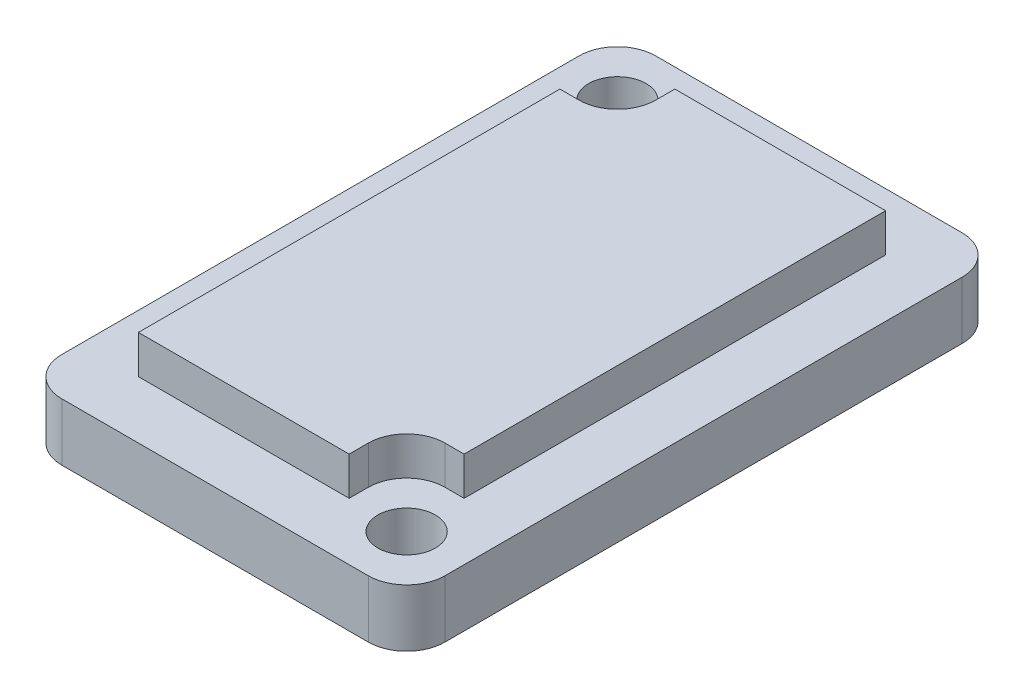
ISO-10303-21;
HEADER;
FILE_DESCRIPTION(('STEP AP214'),'2;1');
FILE_NAME('part.step','',(''),(''),'','','');
FILE_SCHEMA(('AUTOMOTIVE_DESIGN { 1 0 10303 214 1 1 1 1 }'));
ENDSEC;
DATA;
#1=APPLICATION_CONTEXT('core data for automotive mechanical design processes');
#2=APPLICATION_PROTOCOL_DEFINITION('international standard','automotive_design',2000,#1);
#3=PRODUCT_CONTEXT('',#1,'mechanical');
#4=PRODUCT('Part','Part','',(#3));
#5=PRODUCT_RELATED_PRODUCT_CATEGORY('part','',(#4));
#6=PRODUCT_DEFINITION_FORMATION('','',#4);
#7=PRODUCT_DEFINITION_CONTEXT('part definition',#1,'design');
#8=PRODUCT_DEFINITION('design','',#6,#7);
#9=PRODUCT_DEFINITION_SHAPE('','',#8);
#10=(LENGTH_UNIT() NAMED_UNIT(*) SI_UNIT(.MILLI.,.METRE.));
#11=(NAMED_UNIT(*) PLANE_ANGLE_UNIT() SI_UNIT($,.RADIAN.));
#12=(NAMED_UNIT(*) SI_UNIT($,.STERADIAN.) SOLID_ANGLE_UNIT());
#13=UNCERTAINTY_MEASURE_WITH_UNIT(LENGTH_MEASURE(1.E-05),#10,'distance_accuracy_value','');
#14=(GEOMETRIC_REPRESENTATION_CONTEXT(3) GLOBAL_UNCERTAINTY_ASSIGNED_CONTEXT((#13)) GLOBAL_UNIT_ASSIGNED_CONTEXT((#10,
#11,#12)) REPRESENTATION_CONTEXT('',''));
#15=CARTESIAN_POINT('',(0.,0.,0.));
#16=DIRECTION('',(0.,0.,1.));
#17=DIRECTION('',(1.,0.,0.));
#18=AXIS2_PLACEMENT_3D('',#15,#16,#17);
#19=CARTESIAN_POINT('',(0.,3.,0.));
#20=DIRECTION('',(0.,-1.,0.));
#21=DIRECTION('',(0.,0.,-1.));
#22=AXIS2_PLACEMENT_3D('',#19,#20,#21);
#23=PLANE('',#22);
#24=CARTESIAN_POINT('',(-7.,3.,-12.5));
#25=DIRECTION('',(0.,1.,0.));
#26=DIRECTION('',(0.,0.,1.));
#27=AXIS2_PLACEMENT_3D('',#24,#25,#26);
#28=CIRCLE('',#27,1.5);
#29=CARTESIAN_POINT('',(-7.,3.,-11.));
#30=VERTEX_POINT('',#29);
#31=EDGE_CURVE('E281',#30,#30,#28,.T.);
#32=ORIENTED_EDGE('',*,*,#31,.F.);
#33=EDGE_LOOP('',(#32));
#34=FACE_BOUND('',#33,.T.);
#35=CARTESIAN_POINT('',(7.,3.,12.5));
#36=DIRECTION('',(0.,1.,0.));
#37=DIRECTION('',(0.,0.,1.));
#38=AXIS2_PLACEMENT_3D('',#35,#36,#37);
#39=CIRCLE('',#38,1.5);
#40=CARTESIAN_POINT('',(7.,3.,14.));
#41=VERTEX_POINT('',#40);
#42=EDGE_CURVE('E288',#41,#41,#39,.T.);
#43=ORIENTED_EDGE('',*,*,#42,.F.);
#44=EDGE_LOOP('',(#43));
#45=FACE_BOUND('',#44,.T.);
#46=DIRECTION('',(-1.,0.,0.));
#47=VECTOR('',#46,1.);
#48=CARTESIAN_POINT('',(-10.,3.,-15.5));
#49=LINE('',#48,#47);
#50=CARTESIAN_POINT('',(8.,3.,-15.5));
#51=VERTEX_POINT('',#50);
#52=CARTESIAN_POINT('',(-8.,3.,-15.5));
#53=VERTEX_POINT('',#52);
#54=EDGE_CURVE('E208',#51,#53,#49,.T.);
#55=ORIENTED_EDGE('',*,*,#54,.T.);
#56=CARTESIAN_POINT('',(-8.,3.,-13.5));
#57=DIRECTION('',(0.,-1.,0.));
#58=DIRECTION('',(0.,0.,-1.));
#59=AXIS2_PLACEMENT_3D('',#56,#57,#58);
#60=CIRCLE('',#59,2.);
#61=CARTESIAN_POINT('',(-10.,3.,-13.5));
#62=VERTEX_POINT('',#61);
#63=EDGE_CURVE('E266',#53,#62,#60,.F.);
#64=ORIENTED_EDGE('',*,*,#63,.T.);
#65=DIRECTION('',(0.,0.,1.));
#66=VECTOR('',#65,1.);
#67=CARTESIAN_POINT('',(-10.,3.,15.5));
#68=LINE('',#67,#66);
#69=CARTESIAN_POINT('',(-10.,3.,13.5));
#70=VERTEX_POINT('',#69);
#71=EDGE_CURVE('E213',#62,#70,#68,.T.);
#72=ORIENTED_EDGE('',*,*,#71,.T.);
#73=CARTESIAN_POINT('',(-8.,3.,13.5));
#74=DIRECTION('',(0.,-1.,0.));
#75=DIRECTION('',(0.,0.,-1.));
#76=AXIS2_PLACEMENT_3D('',#73,#74,#75);
#77=CIRCLE('',#76,2.);
#78=CARTESIAN_POINT('',(-8.,3.,15.5));
#79=VERTEX_POINT('',#78);
#80=EDGE_CURVE('E263',#70,#79,#77,.F.);
#81=ORIENTED_EDGE('',*,*,#80,.T.);
#82=DIRECTION('',(1.,0.,0.));
#83=VECTOR('',#82,1.);
#84=CARTESIAN_POINT('',(-10.,3.,15.5));
#85=LINE('',#84,#83);
#86=CARTESIAN_POINT('',(8.,3.,15.5));
#87=VERTEX_POINT('',#86);
#88=EDGE_CURVE('E217',#79,#87,#85,.T.);
#89=ORIENTED_EDGE('',*,*,#88,.T.);
#90=CARTESIAN_POINT('',(8.,3.,13.5));
#91=DIRECTION('',(0.,-1.,0.));
#92=DIRECTION('',(0.,0.,-1.));
#93=AXIS2_PLACEMENT_3D('',#90,#91,#92);
#94=CIRCLE('',#93,2.);
#95=CARTESIAN_POINT('',(10.,3.,13.5));
#96=VERTEX_POINT('',#95);
#97=EDGE_CURVE('E257',#87,#96,#94,.F.);
#98=ORIENTED_EDGE('',*,*,#97,.T.);
#99=DIRECTION('',(0.,0.,-1.));
#100=VECTOR('',#99,1.);
#101=CARTESIAN_POINT('',(10.,3.,15.5));
#102=LINE('',#101,#100);
#103=CARTESIAN_POINT('',(10.,3.,-13.5));
#104=VERTEX_POINT('',#103);
#105=EDGE_CURVE('E204',#96,#104,#102,.T.);
#106=ORIENTED_EDGE('',*,*,#105,.T.);
#107=CARTESIAN_POINT('',(8.,3.,-13.5));
#108=DIRECTION('',(0.,-1.,0.));
#109=DIRECTION('',(0.,0.,-1.));
#110=AXIS2_PLACEMENT_3D('',#107,#108,#109);
#111=CIRCLE('',#110,2.);
#112=EDGE_CURVE('E260',#104,#51,#111,.F.);
#113=ORIENTED_EDGE('',*,*,#112,.T.);
#114=EDGE_LOOP('',(#55,#64,#72,#81,#89,#98,#106,#113));
#115=FACE_BOUND('',#114,.T.);
#116=DIRECTION('',(0.,0.,-1.));
#117=VECTOR('',#116,1.);
#118=CARTESIAN_POINT('',(7.,3.,9.50000000000001));
#119=LINE('',#118,#117);
#120=CARTESIAN_POINT('',(7.,3.,9.50000000000001));
#121=VERTEX_POINT('',#120);
#122=CARTESIAN_POINT('',(7.,3.,-12.5));
#123=VERTEX_POINT('',#122);
#124=EDGE_CURVE('E61',#121,#123,#119,.T.);
#125=ORIENTED_EDGE('',*,*,#124,.F.);
#126=DIRECTION('',(1.,0.,0.));
#127=VECTOR('',#126,1.);
#128=CARTESIAN_POINT('',(6.00000000000001,3.,9.50000000000001));
#129=LINE('',#128,#127);
#130=CARTESIAN_POINT('',(6.00000000000001,3.,9.50000000000001));
#131=VERTEX_POINT('',#130);
#132=EDGE_CURVE('E65',#131,#121,#129,.T.);
#133=ORIENTED_EDGE('',*,*,#132,.F.);
#134=CARTESIAN_POINT('',(6.,3.,11.5));
#135=DIRECTION('',(0.,-1.,0.));
#136=DIRECTION('',(0.,0.,1.));
#137=AXIS2_PLACEMENT_3D('',#134,#135,#136);
#138=CIRCLE('',#137,2.);
#139=CARTESIAN_POINT('',(4.,3.,11.5));
#140=VERTEX_POINT('',#139);
#141=EDGE_CURVE('E348',#140,#131,#138,.T.);
#142=ORIENTED_EDGE('',*,*,#141,.F.);
#143=DIRECTION('',(0.,0.,-1.));
#144=VECTOR('',#143,1.);
#145=CARTESIAN_POINT('',(4.,3.,12.5));
#146=LINE('',#145,#144);
#147=CARTESIAN_POINT('',(4.,3.,12.5));
#148=VERTEX_POINT('',#147);
#149=EDGE_CURVE('E344',#148,#140,#146,.T.);
#150=ORIENTED_EDGE('',*,*,#149,.F.);
#151=DIRECTION('',(1.,0.,0.));
#152=VECTOR('',#151,1.);
#153=CARTESIAN_POINT('',(-7.,3.,12.5));
#154=LINE('',#153,#152);
#155=CARTESIAN_POINT('',(-7.,3.,12.5));
#156=VERTEX_POINT('',#155);
#157=EDGE_CURVE('E340',#156,#148,#154,.T.);
#158=ORIENTED_EDGE('',*,*,#157,.F.);
#159=DIRECTION('',(0.,0.,1.));
#160=VECTOR('',#159,1.);
#161=CARTESIAN_POINT('',(-7.,3.,12.5));
#162=LINE('',#161,#160);
#163=CARTESIAN_POINT('',(-7.,3.,-9.50000000000001));
#164=VERTEX_POINT('',#163);
#165=EDGE_CURVE('E336',#164,#156,#162,.T.);
#166=ORIENTED_EDGE('',*,*,#165,.F.);
#167=DIRECTION('',(-1.,0.,0.));
#168=VECTOR('',#167,1.);
#169=CARTESIAN_POINT('',(-7.,3.,-9.50000000000001));
#170=LINE('',#169,#168);
#171=CARTESIAN_POINT('',(-6.00000000000001,3.,-9.50000000000001));
#172=VERTEX_POINT('',#171);
#173=EDGE_CURVE('E332',#172,#164,#170,.T.);
#174=ORIENTED_EDGE('',*,*,#173,.F.);
#175=CARTESIAN_POINT('',(-6.,3.,-11.5));
#176=DIRECTION('',(0.,-1.,0.));
#177=DIRECTION('',(0.,0.,1.));
#178=AXIS2_PLACEMENT_3D('',#175,#176,#177);
#179=CIRCLE('',#178,2.);
#180=CARTESIAN_POINT('',(-4.,3.,-11.5));
#181=VERTEX_POINT('',#180);
#182=EDGE_CURVE('E328',#181,#172,#179,.T.);
#183=ORIENTED_EDGE('',*,*,#182,.F.);
#184=DIRECTION('',(0.,0.,1.));
#185=VECTOR('',#184,1.);
#186=CARTESIAN_POINT('',(-4.,3.,-11.5));
#187=LINE('',#186,#185);
#188=CARTESIAN_POINT('',(-4.,3.,-12.5));
#189=VERTEX_POINT('',#188);
#190=EDGE_CURVE('E324',#189,#181,#187,.T.);
#191=ORIENTED_EDGE('',*,*,#190,.F.);
#192=DIRECTION('',(-1.,0.,0.));
#193=VECTOR('',#192,1.);
#194=CARTESIAN_POINT('',(-4.,3.,-12.5));
#195=LINE('',#194,#193);
#196=EDGE_CURVE('E321',#123,#189,#195,.T.);
#197=ORIENTED_EDGE('',*,*,#196,.F.);
#198=EDGE_LOOP('',(#125,#133,#142,#150,#158,#166,#174,#183,#191,#197));
#199=FACE_BOUND('',#198,.T.);
#200=ADVANCED_FACE('F43',(#34,#45,#115,#199),#23,.F.);
#201=CARTESIAN_POINT('',(10.,3.,15.5));
#202=DIRECTION('',(-1.,0.,0.));
#203=DIRECTION('',(0.,0.,1.));
#204=AXIS2_PLACEMENT_3D('',#201,#202,#203);
#205=PLANE('',#204);
#206=DIRECTION('',(0.,0.,-1.));
#207=VECTOR('',#206,1.);
#208=CARTESIAN_POINT('',(10.,0.,15.5));
#209=LINE('',#208,#207);
#210=CARTESIAN_POINT('',(10.,0.,13.5));
#211=VERTEX_POINT('',#210);
#212=CARTESIAN_POINT('',(10.,0.,-13.5));
#213=VERTEX_POINT('',#212);
#214=EDGE_CURVE('E193',#211,#213,#209,.T.);
#215=ORIENTED_EDGE('',*,*,#214,.T.);
#216=DIRECTION('',(0.,-1.,0.));
#217=VECTOR('',#216,1.);
#218=CARTESIAN_POINT('',(10.,3.,-13.5));
#219=LINE('',#218,#217);
#220=EDGE_CURVE('E11',#213,#104,#219,.F.);
#221=ORIENTED_EDGE('',*,*,#220,.T.);
#222=ORIENTED_EDGE('',*,*,#105,.F.);
#223=DIRECTION('',(0.,-1.,0.));
#224=VECTOR('',#223,1.);
#225=CARTESIAN_POINT('',(10.,3.,13.5));
#226=LINE('',#225,#224);
#227=EDGE_CURVE('E53',#96,#211,#226,.T.);
#228=ORIENTED_EDGE('',*,*,#227,.T.);
#229=EDGE_LOOP('',(#215,#221,#222,#228));
#230=FACE_BOUND('',#229,.T.);
#231=ADVANCED_FACE('F419',(#230),#205,.F.);
#232=CARTESIAN_POINT('',(-10.,3.,-15.5));
#233=DIRECTION('',(0.,0.,1.));
#234=DIRECTION('',(1.,0.,0.));
#235=AXIS2_PLACEMENT_3D('',#232,#233,#234);
#236=PLANE('',#235);
#237=DIRECTION('',(-1.,0.,0.));
#238=VECTOR('',#237,1.);
#239=CARTESIAN_POINT('',(-10.,0.,-15.5));
#240=LINE('',#239,#238);
#241=CARTESIAN_POINT('',(8.,0.,-15.5));
#242=VERTEX_POINT('',#241);
#243=CARTESIAN_POINT('',(-8.,0.,-15.5));
#244=VERTEX_POINT('',#243);
#245=EDGE_CURVE('E198',#242,#244,#240,.T.);
#246=ORIENTED_EDGE('',*,*,#245,.T.);
#247=DIRECTION('',(0.,-1.,0.));
#248=VECTOR('',#247,1.);
#249=CARTESIAN_POINT('',(-8.,3.,-15.5));
#250=LINE('',#249,#248);
#251=EDGE_CURVE('E254',#244,#53,#250,.F.);
#252=ORIENTED_EDGE('',*,*,#251,.T.);
#253=ORIENTED_EDGE('',*,*,#54,.F.);
#254=DIRECTION('',(0.,-1.,0.));
#255=VECTOR('',#254,1.);
#256=CARTESIAN_POINT('',(8.,3.,-15.5));
#257=LINE('',#256,#255);
#258=EDGE_CURVE('E250',#51,#242,#257,.T.);
#259=ORIENTED_EDGE('',*,*,#258,.T.);
#260=EDGE_LOOP('',(#246,#252,#253,#259));
#261=FACE_BOUND('',#260,.T.);
#262=ADVANCED_FACE('F425',(#261),#236,.F.);
#263=CARTESIAN_POINT('',(-10.,3.,15.5));
#264=DIRECTION('',(1.,0.,0.));
#265=DIRECTION('',(0.,0.,-1.));
#266=AXIS2_PLACEMENT_3D('',#263,#264,#265);
#267=PLANE('',#266);
#268=ORIENTED_EDGE('',*,*,#71,.F.);
#269=DIRECTION('',(0.,-1.,0.));
#270=VECTOR('',#269,1.);
#271=CARTESIAN_POINT('',(-10.,3.,-13.5));
#272=LINE('',#271,#270);
#273=CARTESIAN_POINT('',(-10.,0.,-13.5));
#274=VERTEX_POINT('',#273);
#275=EDGE_CURVE('E234',#62,#274,#272,.T.);
#276=ORIENTED_EDGE('',*,*,#275,.T.);
#277=DIRECTION('',(0.,0.,1.));
#278=VECTOR('',#277,1.);
#279=CARTESIAN_POINT('',(-10.,0.,15.5));
#280=LINE('',#279,#278);
#281=CARTESIAN_POINT('',(-10.,0.,13.5));
#282=VERTEX_POINT('',#281);
#283=EDGE_CURVE('E225',#274,#282,#280,.T.);
#284=ORIENTED_EDGE('',*,*,#283,.T.);
#285=DIRECTION('',(0.,-1.,0.));
#286=VECTOR('',#285,1.);
#287=CARTESIAN_POINT('',(-10.,3.,13.5));
#288=LINE('',#287,#286);
#289=EDGE_CURVE('E220',#282,#70,#288,.F.);
#290=ORIENTED_EDGE('',*,*,#289,.T.);
#291=EDGE_LOOP('',(#268,#276,#284,#290));
#292=FACE_BOUND('',#291,.T.);
#293=ADVANCED_FACE('F440',(#292),#267,.F.);
#294=CARTESIAN_POINT('',(-10.,3.,15.5));
#295=DIRECTION('',(0.,0.,-1.));
#296=DIRECTION('',(-1.,0.,0.));
#297=AXIS2_PLACEMENT_3D('',#294,#295,#296);
#298=PLANE('',#297);
#299=ORIENTED_EDGE('',*,*,#88,.F.);
#300=DIRECTION('',(0.,-1.,0.));
#301=VECTOR('',#300,1.);
#302=CARTESIAN_POINT('',(-8.,3.,15.5));
#303=LINE('',#302,#301);
#304=CARTESIAN_POINT('',(-8.,0.,15.5));
#305=VERTEX_POINT('',#304);
#306=EDGE_CURVE('E272',#79,#305,#303,.T.);
#307=ORIENTED_EDGE('',*,*,#306,.T.);
#308=DIRECTION('',(1.,0.,0.));
#309=VECTOR('',#308,1.);
#310=CARTESIAN_POINT('',(-10.,0.,15.5));
#311=LINE('',#310,#309);
#312=CARTESIAN_POINT('',(8.,0.,15.5));
#313=VERTEX_POINT('',#312);
#314=EDGE_CURVE('E209',#305,#313,#311,.T.);
#315=ORIENTED_EDGE('',*,*,#314,.T.);
#316=DIRECTION('',(0.,-1.,0.));
#317=VECTOR('',#316,1.);
#318=CARTESIAN_POINT('',(8.,3.,15.5));
#319=LINE('',#318,#317);
#320=EDGE_CURVE('E269',#313,#87,#319,.F.);
#321=ORIENTED_EDGE('',*,*,#320,.T.);
#322=EDGE_LOOP('',(#299,#307,#315,#321));
#323=FACE_BOUND('',#322,.T.);
#324=ADVANCED_FACE('F436',(#323),#298,.F.);
#325=CARTESIAN_POINT('',(0.,0.,0.));
#326=DIRECTION('',(0.,-1.,0.));
#327=DIRECTION('',(0.,0.,-1.));
#328=AXIS2_PLACEMENT_3D('',#325,#326,#327);
#329=PLANE('',#328);
#330=CARTESIAN_POINT('',(-7.,0.,-12.5));
#331=DIRECTION('',(0.,-1.,0.));
#332=DIRECTION('',(0.,0.,-1.));
#333=AXIS2_PLACEMENT_3D('',#330,#331,#332);
#334=CIRCLE('',#333,1.5);
#335=CARTESIAN_POINT('',(-7.,0.,-14.));
#336=VERTEX_POINT('',#335);
#337=EDGE_CURVE('E47',#336,#336,#334,.T.);
#338=ORIENTED_EDGE('',*,*,#337,.F.);
#339=EDGE_LOOP('',(#338));
#340=FACE_BOUND('',#339,.T.);
#341=CARTESIAN_POINT('',(7.,0.,12.5));
#342=DIRECTION('',(0.,-1.,0.));
#343=DIRECTION('',(0.,0.,-1.));
#344=AXIS2_PLACEMENT_3D('',#341,#342,#343);
#345=CIRCLE('',#344,1.5);
#346=CARTESIAN_POINT('',(7.,0.,11.));
#347=VERTEX_POINT('',#346);
#348=EDGE_CURVE('E278',#347,#347,#345,.T.);
#349=ORIENTED_EDGE('',*,*,#348,.F.);
#350=EDGE_LOOP('',(#349));
#351=FACE_BOUND('',#350,.T.);
#352=ORIENTED_EDGE('',*,*,#283,.F.);
#353=CARTESIAN_POINT('',(-8.,0.,-13.5));
#354=DIRECTION('',(0.,-1.,0.));
#355=DIRECTION('',(0.,0.,-1.));
#356=AXIS2_PLACEMENT_3D('',#353,#354,#355);
#357=CIRCLE('',#356,2.);
#358=EDGE_CURVE('E247',#274,#244,#357,.T.);
#359=ORIENTED_EDGE('',*,*,#358,.T.);
#360=ORIENTED_EDGE('',*,*,#245,.F.);
#361=CARTESIAN_POINT('',(8.,0.,-13.5));
#362=DIRECTION('',(0.,-1.,0.));
#363=DIRECTION('',(0.,0.,-1.));
#364=AXIS2_PLACEMENT_3D('',#361,#362,#363);
#365=CIRCLE('',#364,2.);
#366=EDGE_CURVE('E241',#242,#213,#365,.T.);
#367=ORIENTED_EDGE('',*,*,#366,.T.);
#368=ORIENTED_EDGE('',*,*,#214,.F.);
#369=CARTESIAN_POINT('',(8.,0.,13.5));
#370=DIRECTION('',(0.,-1.,0.));
#371=DIRECTION('',(0.,0.,-1.));
#372=AXIS2_PLACEMENT_3D('',#369,#370,#371);
#373=CIRCLE('',#372,2.);
#374=EDGE_CURVE('E238',#211,#313,#373,.T.);
#375=ORIENTED_EDGE('',*,*,#374,.T.);
#376=ORIENTED_EDGE('',*,*,#314,.F.);
#377=CARTESIAN_POINT('',(-8.,0.,13.5));
#378=DIRECTION('',(0.,-1.,0.));
#379=DIRECTION('',(0.,0.,-1.));
#380=AXIS2_PLACEMENT_3D('',#377,#378,#379);
#381=CIRCLE('',#380,2.);
#382=EDGE_CURVE('E244',#305,#282,#381,.T.);
#383=ORIENTED_EDGE('',*,*,#382,.T.);
#384=EDGE_LOOP('',(#352,#359,#360,#367,#368,#375,#376,#383));
#385=FACE_BOUND('',#384,.T.);
#386=ADVANCED_FACE('F432',(#340,#351,#385),#329,.T.);
#387=CARTESIAN_POINT('',(-8.,3.,-13.5));
#388=DIRECTION('',(0.,-1.,0.));
#389=DIRECTION('',(0.,0.,-1.));
#390=AXIS2_PLACEMENT_3D('',#387,#388,#389);
#391=CYLINDRICAL_SURFACE('',#390,2.);
#392=ORIENTED_EDGE('',*,*,#63,.F.);
#393=ORIENTED_EDGE('',*,*,#251,.F.);
#394=ORIENTED_EDGE('',*,*,#358,.F.);
#395=ORIENTED_EDGE('',*,*,#275,.F.);
#396=EDGE_LOOP('',(#392,#393,#394,#395));
#397=FACE_BOUND('',#396,.T.);
#398=ADVANCED_FACE('F435',(#397),#391,.T.);
#399=CARTESIAN_POINT('',(-8.,3.,13.5));
#400=DIRECTION('',(0.,-1.,0.));
#401=DIRECTION('',(0.,0.,-1.));
#402=AXIS2_PLACEMENT_3D('',#399,#400,#401);
#403=CYLINDRICAL_SURFACE('',#402,2.);
#404=ORIENTED_EDGE('',*,*,#80,.F.);
#405=ORIENTED_EDGE('',*,*,#289,.F.);
#406=ORIENTED_EDGE('',*,*,#382,.F.);
#407=ORIENTED_EDGE('',*,*,#306,.F.);
#408=EDGE_LOOP('',(#404,#405,#406,#407));
#409=FACE_BOUND('',#408,.T.);
#410=ADVANCED_FACE('F450',(#409),#403,.T.);
#411=CARTESIAN_POINT('',(8.,3.,-13.5));
#412=DIRECTION('',(0.,-1.,0.));
#413=DIRECTION('',(0.,0.,-1.));
#414=AXIS2_PLACEMENT_3D('',#411,#412,#413);
#415=CYLINDRICAL_SURFACE('',#414,2.);
#416=ORIENTED_EDGE('',*,*,#112,.F.);
#417=ORIENTED_EDGE('',*,*,#220,.F.);
#418=ORIENTED_EDGE('',*,*,#366,.F.);
#419=ORIENTED_EDGE('',*,*,#258,.F.);
#420=EDGE_LOOP('',(#416,#417,#418,#419));
#421=FACE_BOUND('',#420,.T.);
#422=ADVANCED_FACE('F453',(#421),#415,.T.);
#423=CARTESIAN_POINT('',(8.,3.,13.5));
#424=DIRECTION('',(0.,-1.,0.));
#425=DIRECTION('',(0.,0.,-1.));
#426=AXIS2_PLACEMENT_3D('',#423,#424,#425);
#427=CYLINDRICAL_SURFACE('',#426,2.);
#428=ORIENTED_EDGE('',*,*,#97,.F.);
#429=ORIENTED_EDGE('',*,*,#320,.F.);
#430=ORIENTED_EDGE('',*,*,#374,.F.);
#431=ORIENTED_EDGE('',*,*,#227,.F.);
#432=EDGE_LOOP('',(#428,#429,#430,#431));
#433=FACE_BOUND('',#432,.T.);
#434=ADVANCED_FACE('F45',(#433),#427,.T.);
#435=CARTESIAN_POINT('',(7.,5.,9.50000000000001));
#436=DIRECTION('',(-1.,0.,0.));
#437=DIRECTION('',(0.,0.,1.));
#438=AXIS2_PLACEMENT_3D('',#435,#436,#437);
#439=PLANE('',#438);
#440=ORIENTED_EDGE('',*,*,#124,.T.);
#441=DIRECTION('',(0.,-1.,0.));
#442=VECTOR('',#441,1.);
#443=CARTESIAN_POINT('',(7.,5.,-12.5));
#444=LINE('',#443,#442);
#445=CARTESIAN_POINT('',(7.,5.,-12.5));
#446=VERTEX_POINT('',#445);
#447=EDGE_CURVE('E173',#446,#123,#444,.T.);
#448=ORIENTED_EDGE('',*,*,#447,.F.);
#449=DIRECTION('',(0.,0.,-1.));
#450=VECTOR('',#449,1.);
#451=CARTESIAN_POINT('',(7.,5.,9.50000000000001));
#452=LINE('',#451,#450);
#453=CARTESIAN_POINT('',(7.,5.,9.50000000000001));
#454=VERTEX_POINT('',#453);
#455=EDGE_CURVE('E180',#454,#446,#452,.T.);
#456=ORIENTED_EDGE('',*,*,#455,.F.);
#457=DIRECTION('',(0.,-1.,0.));
#458=VECTOR('',#457,1.);
#459=CARTESIAN_POINT('',(7.,5.,9.50000000000001));
#460=LINE('',#459,#458);
#461=EDGE_CURVE('E318',#454,#121,#460,.T.);
#462=ORIENTED_EDGE('',*,*,#461,.T.);
#463=EDGE_LOOP('',(#440,#448,#456,#462));
#464=FACE_BOUND('',#463,.T.);
#465=ADVANCED_FACE('F191',(#464),#439,.F.);
#466=CARTESIAN_POINT('',(-4.,5.,-12.5));
#467=DIRECTION('',(0.,0.,1.));
#468=DIRECTION('',(1.,0.,0.));
#469=AXIS2_PLACEMENT_3D('',#466,#467,#468);
#470=PLANE('',#469);
#471=ORIENTED_EDGE('',*,*,#196,.T.);
#472=DIRECTION('',(0.,-1.,0.));
#473=VECTOR('',#472,1.);
#474=CARTESIAN_POINT('',(-4.,5.,-12.5));
#475=LINE('',#474,#473);
#476=CARTESIAN_POINT('',(-4.,5.,-12.5));
#477=VERTEX_POINT('',#476);
#478=EDGE_CURVE('E175',#477,#189,#475,.T.);
#479=ORIENTED_EDGE('',*,*,#478,.F.);
#480=DIRECTION('',(-1.,0.,0.));
#481=VECTOR('',#480,1.);
#482=CARTESIAN_POINT('',(-4.,5.,-12.5));
#483=LINE('',#482,#481);
#484=EDGE_CURVE('E168',#446,#477,#483,.T.);
#485=ORIENTED_EDGE('',*,*,#484,.F.);
#486=ORIENTED_EDGE('',*,*,#447,.T.);
#487=EDGE_LOOP('',(#471,#479,#485,#486));
#488=FACE_BOUND('',#487,.T.);
#489=ADVANCED_FACE('F171',(#488),#470,.F.);
#490=CARTESIAN_POINT('',(-4.,5.,-11.5));
#491=DIRECTION('',(1.,0.,0.));
#492=DIRECTION('',(0.,0.,-1.));
#493=AXIS2_PLACEMENT_3D('',#490,#491,#492);
#494=PLANE('',#493);
#495=ORIENTED_EDGE('',*,*,#190,.T.);
#496=DIRECTION('',(0.,-1.,0.));
#497=VECTOR('',#496,1.);
#498=CARTESIAN_POINT('',(-4.,5.,-11.5));
#499=LINE('',#498,#497);
#500=CARTESIAN_POINT('',(-4.,5.,-11.5));
#501=VERTEX_POINT('',#500);
#502=EDGE_CURVE('E200',#501,#181,#499,.T.);
#503=ORIENTED_EDGE('',*,*,#502,.F.);
#504=DIRECTION('',(0.,0.,1.));
#505=VECTOR('',#504,1.);
#506=CARTESIAN_POINT('',(-4.,5.,-11.5));
#507=LINE('',#506,#505);
#508=EDGE_CURVE('E179',#477,#501,#507,.T.);
#509=ORIENTED_EDGE('',*,*,#508,.F.);
#510=ORIENTED_EDGE('',*,*,#478,.T.);
#511=EDGE_LOOP('',(#495,#503,#509,#510));
#512=FACE_BOUND('',#511,.T.);
#513=ADVANCED_FACE('F386',(#512),#494,.F.);
#514=CARTESIAN_POINT('',(-6.,5.,-11.5));
#515=DIRECTION('',(0.,-1.,0.));
#516=DIRECTION('',(0.,0.,-1.));
#517=AXIS2_PLACEMENT_3D('',#514,#515,#516);
#518=CYLINDRICAL_SURFACE('',#517,2.);
#519=ORIENTED_EDGE('',*,*,#182,.T.);
#520=DIRECTION('',(0.,-1.,0.));
#521=VECTOR('',#520,1.);
#522=CARTESIAN_POINT('',(-6.00000000000001,5.,-9.50000000000001));
#523=LINE('',#522,#521);
#524=CARTESIAN_POINT('',(-6.00000000000001,5.,-9.50000000000001));
#525=VERTEX_POINT('',#524);
#526=EDGE_CURVE('E375',#525,#172,#523,.T.);
#527=ORIENTED_EDGE('',*,*,#526,.F.);
#528=CARTESIAN_POINT('',(-6.,5.,-11.5));
#529=DIRECTION('',(0.,-1.,0.));
#530=DIRECTION('',(0.,0.,1.));
#531=AXIS2_PLACEMENT_3D('',#528,#529,#530);
#532=CIRCLE('',#531,2.);
#533=EDGE_CURVE('E298',#501,#525,#532,.T.);
#534=ORIENTED_EDGE('',*,*,#533,.F.);
#535=ORIENTED_EDGE('',*,*,#502,.T.);
#536=EDGE_LOOP('',(#519,#527,#534,#535));
#537=FACE_BOUND('',#536,.T.);
#538=ADVANCED_FACE('F383',(#537),#518,.F.);
#539=CARTESIAN_POINT('',(-7.,5.,-9.50000000000001));
#540=DIRECTION('',(0.,0.,1.));
#541=DIRECTION('',(1.,0.,0.));
#542=AXIS2_PLACEMENT_3D('',#539,#540,#541);
#543=PLANE('',#542);
#544=ORIENTED_EDGE('',*,*,#173,.T.);
#545=DIRECTION('',(0.,-1.,0.));
#546=VECTOR('',#545,1.);
#547=CARTESIAN_POINT('',(-7.,5.,-9.50000000000001));
#548=LINE('',#547,#546);
#549=CARTESIAN_POINT('',(-7.,5.,-9.50000000000001));
#550=VERTEX_POINT('',#549);
#551=EDGE_CURVE('E371',#550,#164,#548,.T.);
#552=ORIENTED_EDGE('',*,*,#551,.F.);
#553=DIRECTION('',(-1.,0.,0.));
#554=VECTOR('',#553,1.);
#555=CARTESIAN_POINT('',(-7.,5.,-9.50000000000001));
#556=LINE('',#555,#554);
#557=EDGE_CURVE('E301',#525,#550,#556,.T.);
#558=ORIENTED_EDGE('',*,*,#557,.F.);
#559=ORIENTED_EDGE('',*,*,#526,.T.);
#560=EDGE_LOOP('',(#544,#552,#558,#559));
#561=FACE_BOUND('',#560,.T.);
#562=ADVANCED_FACE('F389',(#561),#543,.F.);
#563=CARTESIAN_POINT('',(-7.,5.,12.5));
#564=DIRECTION('',(1.,0.,0.));
#565=DIRECTION('',(0.,0.,-1.));
#566=AXIS2_PLACEMENT_3D('',#563,#564,#565);
#567=PLANE('',#566);
#568=ORIENTED_EDGE('',*,*,#165,.T.);
#569=DIRECTION('',(0.,-1.,0.));
#570=VECTOR('',#569,1.);
#571=CARTESIAN_POINT('',(-7.,5.,12.5));
#572=LINE('',#571,#570);
#573=CARTESIAN_POINT('',(-7.,5.,12.5));
#574=VERTEX_POINT('',#573);
#575=EDGE_CURVE('E367',#574,#156,#572,.T.);
#576=ORIENTED_EDGE('',*,*,#575,.F.);
#577=DIRECTION('',(0.,0.,1.));
#578=VECTOR('',#577,1.);
#579=CARTESIAN_POINT('',(-7.,5.,12.5));
#580=LINE('',#579,#578);
#581=EDGE_CURVE('E304',#550,#574,#580,.T.);
#582=ORIENTED_EDGE('',*,*,#581,.F.);
#583=ORIENTED_EDGE('',*,*,#551,.T.);
#584=EDGE_LOOP('',(#568,#576,#582,#583));
#585=FACE_BOUND('',#584,.T.);
#586=ADVANCED_FACE('F393',(#585),#567,.F.);
#587=CARTESIAN_POINT('',(-7.,5.,12.5));
#588=DIRECTION('',(0.,0.,-1.));
#589=DIRECTION('',(-1.,0.,0.));
#590=AXIS2_PLACEMENT_3D('',#587,#588,#589);
#591=PLANE('',#590);
#592=ORIENTED_EDGE('',*,*,#157,.T.);
#593=DIRECTION('',(0.,-1.,0.));
#594=VECTOR('',#593,1.);
#595=CARTESIAN_POINT('',(4.,5.,12.5));
#596=LINE('',#595,#594);
#597=CARTESIAN_POINT('',(4.,5.,12.5));
#598=VERTEX_POINT('',#597);
#599=EDGE_CURVE('E363',#598,#148,#596,.T.);
#600=ORIENTED_EDGE('',*,*,#599,.F.);
#601=DIRECTION('',(1.,0.,0.));
#602=VECTOR('',#601,1.);
#603=CARTESIAN_POINT('',(-7.,5.,12.5));
#604=LINE('',#603,#602);
#605=EDGE_CURVE('E307',#574,#598,#604,.T.);
#606=ORIENTED_EDGE('',*,*,#605,.F.);
#607=ORIENTED_EDGE('',*,*,#575,.T.);
#608=EDGE_LOOP('',(#592,#600,#606,#607));
#609=FACE_BOUND('',#608,.T.);
#610=ADVANCED_FACE('F400',(#609),#591,.F.);
#611=CARTESIAN_POINT('',(4.,5.,12.5));
#612=DIRECTION('',(-1.,0.,0.));
#613=DIRECTION('',(0.,0.,1.));
#614=AXIS2_PLACEMENT_3D('',#611,#612,#613);
#615=PLANE('',#614);
#616=ORIENTED_EDGE('',*,*,#149,.T.);
#617=DIRECTION('',(0.,-1.,0.));
#618=VECTOR('',#617,1.);
#619=CARTESIAN_POINT('',(4.,5.,11.5));
#620=LINE('',#619,#618);
#621=CARTESIAN_POINT('',(4.,5.,11.5));
#622=VERTEX_POINT('',#621);
#623=EDGE_CURVE('E359',#622,#140,#620,.T.);
#624=ORIENTED_EDGE('',*,*,#623,.F.);
#625=DIRECTION('',(0.,0.,-1.));
#626=VECTOR('',#625,1.);
#627=CARTESIAN_POINT('',(4.,5.,12.5));
#628=LINE('',#627,#626);
#629=EDGE_CURVE('E310',#598,#622,#628,.T.);
#630=ORIENTED_EDGE('',*,*,#629,.F.);
#631=ORIENTED_EDGE('',*,*,#599,.T.);
#632=EDGE_LOOP('',(#616,#624,#630,#631));
#633=FACE_BOUND('',#632,.T.);
#634=ADVANCED_FACE('F402',(#633),#615,.F.);
#635=CARTESIAN_POINT('',(6.,5.,11.5));
#636=DIRECTION('',(0.,-1.,0.));
#637=DIRECTION('',(0.,0.,-1.));
#638=AXIS2_PLACEMENT_3D('',#635,#636,#637);
#639=CYLINDRICAL_SURFACE('',#638,2.);
#640=ORIENTED_EDGE('',*,*,#141,.T.);
#641=DIRECTION('',(0.,-1.,0.));
#642=VECTOR('',#641,1.);
#643=CARTESIAN_POINT('',(6.00000000000001,5.,9.50000000000001));
#644=LINE('',#643,#642);
#645=CARTESIAN_POINT('',(6.00000000000001,5.,9.50000000000001));
#646=VERTEX_POINT('',#645);
#647=EDGE_CURVE('E355',#646,#131,#644,.T.);
#648=ORIENTED_EDGE('',*,*,#647,.F.);
#649=CARTESIAN_POINT('',(6.,5.,11.5));
#650=DIRECTION('',(0.,-1.,0.));
#651=DIRECTION('',(0.,0.,1.));
#652=AXIS2_PLACEMENT_3D('',#649,#650,#651);
#653=CIRCLE('',#652,2.);
#654=EDGE_CURVE('E313',#622,#646,#653,.T.);
#655=ORIENTED_EDGE('',*,*,#654,.F.);
#656=ORIENTED_EDGE('',*,*,#623,.T.);
#657=EDGE_LOOP('',(#640,#648,#655,#656));
#658=FACE_BOUND('',#657,.T.);
#659=ADVANCED_FACE('F406',(#658),#639,.F.);
#660=CARTESIAN_POINT('',(6.00000000000001,5.,9.50000000000001));
#661=DIRECTION('',(0.,0.,-1.));
#662=DIRECTION('',(-1.,0.,0.));
#663=AXIS2_PLACEMENT_3D('',#660,#661,#662);
#664=PLANE('',#663);
#665=ORIENTED_EDGE('',*,*,#132,.T.);
#666=ORIENTED_EDGE('',*,*,#461,.F.);
#667=DIRECTION('',(1.,0.,0.));
#668=VECTOR('',#667,1.);
#669=CARTESIAN_POINT('',(6.00000000000001,5.,9.50000000000001));
#670=LINE('',#669,#668);
#671=EDGE_CURVE('E185',#646,#454,#670,.T.);
#672=ORIENTED_EDGE('',*,*,#671,.F.);
#673=ORIENTED_EDGE('',*,*,#647,.T.);
#674=EDGE_LOOP('',(#665,#666,#672,#673));
#675=FACE_BOUND('',#674,.T.);
#676=ADVANCED_FACE('F408',(#675),#664,.F.);
#677=CARTESIAN_POINT('',(-6.,5.,-11.5));
#678=DIRECTION('',(0.,1.,0.));
#679=DIRECTION('',(0.,0.,1.));
#680=AXIS2_PLACEMENT_3D('',#677,#678,#679);
#681=PLANE('',#680);
#682=ORIENTED_EDGE('',*,*,#455,.T.);
#683=ORIENTED_EDGE('',*,*,#484,.T.);
#684=ORIENTED_EDGE('',*,*,#508,.T.);
#685=ORIENTED_EDGE('',*,*,#533,.T.);
#686=ORIENTED_EDGE('',*,*,#557,.T.);
#687=ORIENTED_EDGE('',*,*,#581,.T.);
#688=ORIENTED_EDGE('',*,*,#605,.T.);
#689=ORIENTED_EDGE('',*,*,#629,.T.);
#690=ORIENTED_EDGE('',*,*,#654,.T.);
#691=ORIENTED_EDGE('',*,*,#671,.T.);
#692=EDGE_LOOP('',(#682,#683,#684,#685,#686,#687,#688,#689,#690,#691));
#693=FACE_BOUND('',#692,.T.);
#694=ADVANCED_FACE('F183',(#693),#681,.T.);
#695=CARTESIAN_POINT('',(7.,-1.,12.5));
#696=DIRECTION('',(0.,1.,0.));
#697=DIRECTION('',(0.,0.,1.));
#698=AXIS2_PLACEMENT_3D('',#695,#696,#697);
#699=CYLINDRICAL_SURFACE('',#698,1.5);
#700=ORIENTED_EDGE('',*,*,#348,.T.);
#701=EDGE_LOOP('',(#700));
#702=FACE_BOUND('',#701,.T.);
#703=ORIENTED_EDGE('',*,*,#42,.T.);
#704=EDGE_LOOP('',(#703));
#705=FACE_BOUND('',#704,.T.);
#706=ADVANCED_FACE('F415',(#702,#705),#699,.F.);
#707=CARTESIAN_POINT('',(-7.,-1.,-12.5));
#708=DIRECTION('',(0.,1.,0.));
#709=DIRECTION('',(0.,0.,1.));
#710=AXIS2_PLACEMENT_3D('',#707,#708,#709);
#711=CYLINDRICAL_SURFACE('',#710,1.5);
#712=ORIENTED_EDGE('',*,*,#337,.T.);
#713=EDGE_LOOP('',(#712));
#714=FACE_BOUND('',#713,.T.);
#715=ORIENTED_EDGE('',*,*,#31,.T.);
#716=EDGE_LOOP('',(#715));
#717=FACE_BOUND('',#716,.T.);
#718=ADVANCED_FACE('F548',(#714,#717),#711,.F.);
#719=CLOSED_SHELL('',(#200,#231,#262,#293,#324,#386,#398,#410,#422,#434,#465,#489,#513,#538,
#562,#586,#610,#634,#659,#676,#694,#706,#718));
#720=MANIFOLD_SOLID_BREP('B2',#719);
#721=ADVANCED_BREP_SHAPE_REPRESENTATION('',(#18,#720),#14);
#722=SHAPE_DEFINITION_REPRESENTATION(#9,#721);
ENDSEC;
END-ISO-10303-21;
